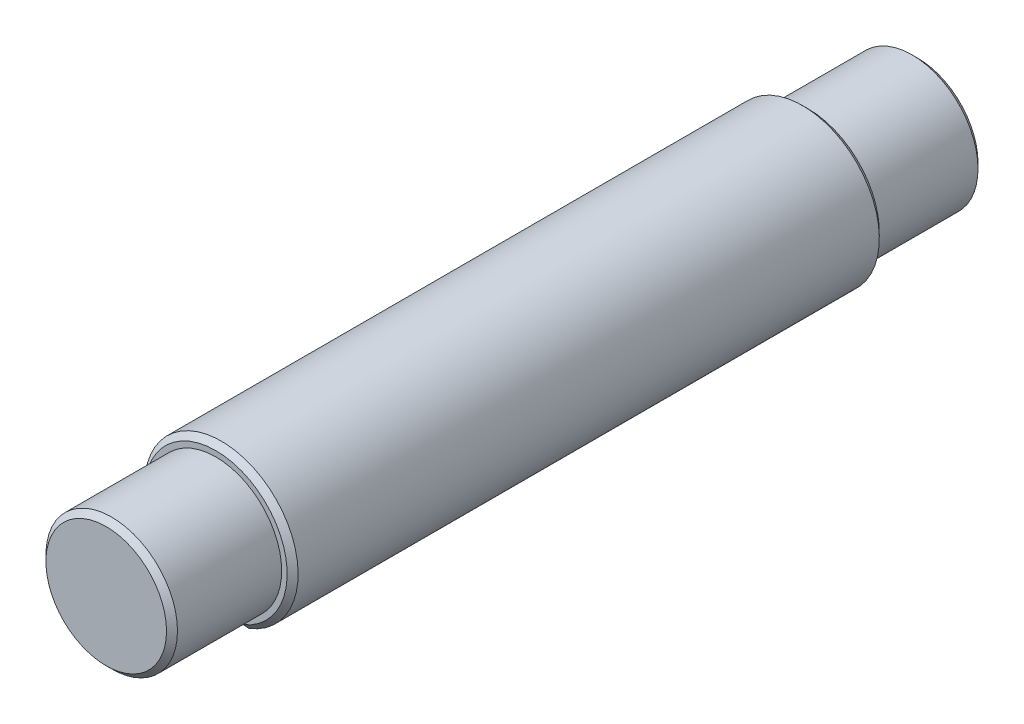
ISO-10303-21;
HEADER;
FILE_DESCRIPTION(('STEP AP214'),'2;1');
FILE_NAME('part.step','',(''),(''),'','','');
FILE_SCHEMA(('AUTOMOTIVE_DESIGN { 1 0 10303 214 1 1 1 1 }'));
ENDSEC;
DATA;
#1=APPLICATION_CONTEXT('core data for automotive mechanical design processes');
#2=APPLICATION_PROTOCOL_DEFINITION('international standard','automotive_design',2000,#1);
#3=PRODUCT_CONTEXT('',#1,'mechanical');
#4=PRODUCT('Part','Part','',(#3));
#5=PRODUCT_RELATED_PRODUCT_CATEGORY('part','',(#4));
#6=PRODUCT_DEFINITION_FORMATION('','',#4);
#7=PRODUCT_DEFINITION_CONTEXT('part definition',#1,'design');
#8=PRODUCT_DEFINITION('design','',#6,#7);
#9=PRODUCT_DEFINITION_SHAPE('','',#8);
#10=(LENGTH_UNIT() NAMED_UNIT(*) SI_UNIT(.MILLI.,.METRE.));
#11=(NAMED_UNIT(*) PLANE_ANGLE_UNIT() SI_UNIT($,.RADIAN.));
#12=(NAMED_UNIT(*) SI_UNIT($,.STERADIAN.) SOLID_ANGLE_UNIT());
#13=UNCERTAINTY_MEASURE_WITH_UNIT(LENGTH_MEASURE(1.E-05),#10,'distance_accuracy_value','');
#14=(GEOMETRIC_REPRESENTATION_CONTEXT(3) GLOBAL_UNCERTAINTY_ASSIGNED_CONTEXT((#13)) GLOBAL_UNIT_ASSIGNED_CONTEXT((#10,
#11,#12)) REPRESENTATION_CONTEXT('',''));
#15=CARTESIAN_POINT('',(0.,0.,0.));
#16=DIRECTION('',(0.,0.,1.));
#17=DIRECTION('',(1.,0.,0.));
#18=AXIS2_PLACEMENT_3D('',#15,#16,#17);
#19=CARTESIAN_POINT('',(0.,0.,37.));
#20=DIRECTION('',(0.,0.,-1.));
#21=DIRECTION('',(-1.,0.,0.));
#22=AXIS2_PLACEMENT_3D('',#19,#20,#21);
#23=CYLINDRICAL_SURFACE('',#22,7.);
#24=DIRECTION('',(0.,0.,-1.));
#25=VECTOR('',#24,1.);
#26=CARTESIAN_POINT('',(2.5,-6.53834841531101,37.));
#27=LINE('',#26,#25);
#28=CARTESIAN_POINT('',(2.5,-6.53834841531101,26.5));
#29=VERTEX_POINT('',#28);
#30=CARTESIAN_POINT('',(2.5,-6.53834841531101,-26.5));
#31=VERTEX_POINT('',#30);
#32=EDGE_CURVE('E146',#29,#31,#27,.T.);
#33=ORIENTED_EDGE('',*,*,#32,.T.);
#34=CARTESIAN_POINT('',(0.,0.,-26.5));
#35=DIRECTION('',(0.,0.,-1.));
#36=DIRECTION('',(-1.,0.,0.));
#37=AXIS2_PLACEMENT_3D('',#34,#35,#36);
#38=CIRCLE('',#37,7.);
#39=CARTESIAN_POINT('',(-2.5,-6.53834841531101,-26.5));
#40=VERTEX_POINT('',#39);
#41=EDGE_CURVE('E264',#31,#40,#38,.F.);
#42=ORIENTED_EDGE('',*,*,#41,.T.);
#43=DIRECTION('',(0.,0.,-1.));
#44=VECTOR('',#43,1.);
#45=CARTESIAN_POINT('',(-2.5,-6.53834841531101,37.));
#46=LINE('',#45,#44);
#47=CARTESIAN_POINT('',(-2.5,-6.53834841531101,26.5));
#48=VERTEX_POINT('',#47);
#49=EDGE_CURVE('E143',#40,#48,#46,.F.);
#50=ORIENTED_EDGE('',*,*,#49,.T.);
#51=CARTESIAN_POINT('',(0.,0.,26.5));
#52=DIRECTION('',(0.,0.,1.));
#53=DIRECTION('',(1.,0.,0.));
#54=AXIS2_PLACEMENT_3D('',#51,#52,#53);
#55=CIRCLE('',#54,7.);
#56=EDGE_CURVE('E263',#48,#29,#55,.F.);
#57=ORIENTED_EDGE('',*,*,#56,.T.);
#58=EDGE_LOOP('',(#33,#42,#50,#57));
#59=FACE_BOUND('',#58,.T.);
#60=ADVANCED_FACE('F36',(#59),#23,.T.);
#61=CARTESIAN_POINT('',(0.,-7.,27.));
#62=DIRECTION('',(0.,1.,0.));
#63=DIRECTION('',(0.,0.,1.));
#64=AXIS2_PLACEMENT_3D('',#61,#62,#63);
#65=CYLINDRICAL_SURFACE('',#64,2.5);
#66=CARTESIAN_POINT('',(-2.5,-5.45435605731786,27.));
#67=CARTESIAN_POINT('',(-2.50001024965806,-5.4543414367274,27.066990421397));
#68=CARTESIAN_POINT('',(-2.49730766074456,-5.45558986423115,27.1339728576071));
#69=CARTESIAN_POINT('',(-2.48655699342007,-5.46050344433192,27.267391217606));
#70=CARTESIAN_POINT('',(-2.47851112553775,-5.46416759753227,27.3338273558978));
#71=CARTESIAN_POINT('',(-2.45719882557102,-5.47378318611766,27.4654018598714));
#72=CARTESIAN_POINT('',(-2.44395446621823,-5.47972494833872,27.5305445048847));
#73=CARTESIAN_POINT('',(-2.41239773056354,-5.49369035165668,27.6593476505706));
#74=CARTESIAN_POINT('',(-2.39408500729503,-5.50171413528084,27.7230080494492));
#75=CARTESIAN_POINT('',(-2.33184505253746,-5.52852216859036,27.9109704766892));
#76=CARTESIAN_POINT('',(-2.28056973965756,-5.55006534458073,28.0325349409199));
#77=CARTESIAN_POINT('',(-2.16009667726577,-5.5980502687434,28.265394969978));
#78=CARTESIAN_POINT('',(-2.09088024017802,-5.62449711638194,28.3766796624162));
#79=CARTESIAN_POINT('',(-1.93194216605246,-5.6811173953285,28.5926555180297));
#80=CARTESIAN_POINT('',(-1.84129131772597,-5.71141645652258,28.6966314637586));
#81=CARTESIAN_POINT('',(-1.6440247325164,-5.77129106659512,28.8884169369691));
#82=CARTESIAN_POINT('',(-1.53740558511416,-5.80086645933832,28.9762230019235));
#83=CARTESIAN_POINT('',(-1.30552662419109,-5.85751079611205,29.1368988289762));
#84=CARTESIAN_POINT('',(-1.17965801419141,-5.88441492036276,29.2089534877025));
#85=CARTESIAN_POINT('',(-0.916263349803654,-5.93113050419022,29.3305523948046));
#86=CARTESIAN_POINT('',(-0.778742558960747,-5.95094514533806,29.3801067434128));
#87=CARTESIAN_POINT('',(-0.503538212911762,-5.98035028996095,29.4526785710471));
#88=CARTESIAN_POINT('',(-0.366235636683349,-5.99041924152298,29.4769429460133));
#89=CARTESIAN_POINT('',(-0.0891608856613057,-6.00093656296527,29.502275267891));
#90=CARTESIAN_POINT('',(0.0506103107853712,-6.00138866214753,29.5033522066188));
#91=CARTESIAN_POINT('',(0.319586702683726,-5.99290254661358,29.4829313516378));
#92=CARTESIAN_POINT('',(0.448917245472145,-5.98453414521297,29.4628034512649));
#93=CARTESIAN_POINT('',(0.702167963543972,-5.96013005449445,29.4028930910878));
#94=CARTESIAN_POINT('',(0.82608783415044,-5.94409393401056,29.3631095260154));
#95=CARTESIAN_POINT('',(1.06727556823007,-5.90559715444489,29.2645442163381));
#96=CARTESIAN_POINT('',(1.1844130633202,-5.88304219015531,29.2054818206956));
#97=CARTESIAN_POINT('',(1.40742238732224,-5.83371457161593,29.0703092180309));
#98=CARTESIAN_POINT('',(1.51329009151026,-5.80694038196897,28.9941928006955));
#99=CARTESIAN_POINT('',(1.71867537807254,-5.74963576527152,28.8208409664575));
#100=CARTESIAN_POINT('',(1.81722082953265,-5.71897359653013,28.7224958287417));
#101=CARTESIAN_POINT('',(1.99685313522822,-5.65876079183101,28.5105893535751));
#102=CARTESIAN_POINT('',(2.07793113494236,-5.62921072584973,28.3970203460054));
#103=CARTESIAN_POINT('',(2.22284514508405,-5.57361619012468,28.1531453498455));
#104=CARTESIAN_POINT('',(2.28601504206341,-5.54772171984214,28.0224071265261));
#105=CARTESIAN_POINT('',(2.38897619183128,-5.50417661447929,27.7508546265431));
#106=CARTESIAN_POINT('',(2.4288105117282,-5.48651080537515,27.6100594530022));
#107=CARTESIAN_POINT('',(2.47065526537902,-5.46773287951056,27.3898491565922));
#108=CARTESIAN_POINT('',(2.48164099212927,-5.46274303006064,27.3123689332134));
#109=CARTESIAN_POINT('',(2.49631631258703,-5.45604541462647,27.1566098186605));
#110=CARTESIAN_POINT('',(2.50000851178052,-5.45433647659977,27.0783312227393));
#111=CARTESIAN_POINT('',(2.5,-5.45435605731786,27.));
#112=B_SPLINE_CURVE_WITH_KNOTS('',3,(#66,#67,#68,#69,#70,#71,#72,#73,#74,#75,#76,#77,#78,#79,
#80,#81,#82,#83,#84,#85,#86,#87,#88,#89,#90,#91,#92,#93,#94,#95,#96,#97,#98,#99,#100,#101,#102,
#103,#104,#105,#106,#107,#108,#109,#110,#111),.UNSPECIFIED.,.F.,.F.,(4,2,2,2,2,2,2,2,2,2,2,2,2,
2,2,2,2,2,2,2,2,2,4),(0.,0.200891876435012,0.401700695097976,0.601665948391959,
0.801644894158599,1.20075599352942,1.6002844916061,2.02212344548655,2.44405262481498,
2.88432120276328,3.32439195134774,3.74155898035476,4.15856423395471,4.55019084443641,
4.94183947919071,5.33946474085078,5.73723503589979,6.16301556467703,6.58901142297275,
7.02923147484728,7.4686364954648,7.70350874445825,7.93829707423866),.UNSPECIFIED.);
#113=CARTESIAN_POINT('',(-2.5,-5.45435605731786,27.));
#114=VERTEX_POINT('',#113);
#115=CARTESIAN_POINT('',(2.5,-5.45435605731786,27.));
#116=VERTEX_POINT('',#115);
#117=EDGE_CURVE('E124',#114,#116,#112,.T.);
#118=ORIENTED_EDGE('',*,*,#117,.F.);
#119=DIRECTION('',(0.,1.,0.));
#120=VECTOR('',#119,1.);
#121=CARTESIAN_POINT('',(-2.5,-7.,27.));
#122=LINE('',#121,#120);
#123=CARTESIAN_POINT('',(-2.5,-4.,27.));
#124=VERTEX_POINT('',#123);
#125=EDGE_CURVE('E113',#114,#124,#122,.T.);
#126=ORIENTED_EDGE('',*,*,#125,.T.);
#127=CARTESIAN_POINT('',(0.,-4.,27.));
#128=DIRECTION('',(0.,1.,0.));
#129=DIRECTION('',(0.,0.,1.));
#130=AXIS2_PLACEMENT_3D('',#127,#128,#129);
#131=CIRCLE('',#130,2.5);
#132=CARTESIAN_POINT('',(2.5,-4.,27.));
#133=VERTEX_POINT('',#132);
#134=EDGE_CURVE('E282',#124,#133,#131,.T.);
#135=ORIENTED_EDGE('',*,*,#134,.T.);
#136=DIRECTION('',(0.,1.,0.));
#137=VECTOR('',#136,1.);
#138=CARTESIAN_POINT('',(2.5,-7.,27.));
#139=LINE('',#138,#137);
#140=EDGE_CURVE('E142',#116,#133,#139,.T.);
#141=ORIENTED_EDGE('',*,*,#140,.F.);
#142=EDGE_LOOP('',(#118,#126,#135,#141));
#143=FACE_BOUND('',#142,.T.);
#144=ADVANCED_FACE('F163',(#143),#65,.F.);
#145=CARTESIAN_POINT('',(-2.5,-7.,27.));
#146=DIRECTION('',(-1.,0.,0.));
#147=DIRECTION('',(0.,0.,1.));
#148=AXIS2_PLACEMENT_3D('',#145,#146,#147);
#149=PLANE('',#148);
#150=ORIENTED_EDGE('',*,*,#49,.F.);
#151=CARTESIAN_POINT('',(-2.5,-6.53834841531101,-26.5));
#152=CARTESIAN_POINT('',(-2.5,-6.44886881436809,-26.5835972549309));
#153=CARTESIAN_POINT('',(-2.50000000000001,-6.35926664955848,-26.6670625457351));
#154=CARTESIAN_POINT('',(-2.50000000000001,-6.17981717782742,-26.833729212444));
#155=CARTESIAN_POINT('',(-2.50000000000001,-6.0899698708667,-26.9169305883065));
#156=CARTESIAN_POINT('',(-2.50000000000001,-6.,-27.));
#157=B_SPLINE_CURVE_WITH_KNOTS('',3,(#151,#152,#153,#154,#155,#156),.UNSPECIFIED.,.F.,.F.,(4,2,
4),(0.,0.367362252236527,0.734724563343162),.UNSPECIFIED.);
#158=CARTESIAN_POINT('',(-2.50000000000001,-6.,-27.));
#159=VERTEX_POINT('',#158);
#160=EDGE_CURVE('E111',#40,#159,#157,.T.);
#161=ORIENTED_EDGE('',*,*,#160,.T.);
#162=DIRECTION('',(0.,1.,0.));
#163=VECTOR('',#162,1.);
#164=CARTESIAN_POINT('',(-2.50000000000001,-7.,-27.));
#165=LINE('',#164,#163);
#166=CARTESIAN_POINT('',(-2.50000000000001,-5.45435605731785,-27.));
#167=VERTEX_POINT('',#166);
#168=EDGE_CURVE('E103',#159,#167,#165,.T.);
#169=ORIENTED_EDGE('',*,*,#168,.T.);
#170=CARTESIAN_POINT('',(-2.50000000000001,-4.,-27.));
#171=VERTEX_POINT('',#170);
#172=EDGE_CURVE('E109',#167,#171,#165,.T.);
#173=ORIENTED_EDGE('',*,*,#172,.T.);
#174=DIRECTION('',(0.,0.,1.));
#175=VECTOR('',#174,1.);
#176=CARTESIAN_POINT('',(-2.5,-4.,27.));
#177=LINE('',#176,#175);
#178=EDGE_CURVE('E280',#171,#124,#177,.T.);
#179=ORIENTED_EDGE('',*,*,#178,.T.);
#180=ORIENTED_EDGE('',*,*,#125,.F.);
#181=CARTESIAN_POINT('',(-2.5,-6.00000000000001,27.));
#182=VERTEX_POINT('',#181);
#183=EDGE_CURVE('E137',#182,#114,#122,.T.);
#184=ORIENTED_EDGE('',*,*,#183,.F.);
#185=CARTESIAN_POINT('',(-2.5,-6.00000000000001,27.));
#186=CARTESIAN_POINT('',(-2.5,-6.08996987086671,26.9169305883065));
#187=CARTESIAN_POINT('',(-2.5,-6.17981717782743,26.833729212444));
#188=CARTESIAN_POINT('',(-2.5,-6.35926664955848,26.6670625457351));
#189=CARTESIAN_POINT('',(-2.5,-6.44886881436809,26.5835972549309));
#190=CARTESIAN_POINT('',(-2.5,-6.53834841531101,26.5));
#191=B_SPLINE_CURVE_WITH_KNOTS('',3,(#185,#186,#187,#188,#189,#190),.UNSPECIFIED.,.F.,.F.,(4,2,
4),(0.,0.367362311106631,0.734724563343148),.UNSPECIFIED.);
#192=EDGE_CURVE('E188',#182,#48,#191,.T.);
#193=ORIENTED_EDGE('',*,*,#192,.T.);
#194=EDGE_LOOP('',(#150,#161,#169,#173,#179,#180,#184,#193));
#195=FACE_BOUND('',#194,.T.);
#196=ADVANCED_FACE('F106',(#195),#149,.F.);
#197=CARTESIAN_POINT('',(0.,-7.,-27.));
#198=DIRECTION('',(0.,1.,0.));
#199=DIRECTION('',(0.,0.,1.));
#200=AXIS2_PLACEMENT_3D('',#197,#198,#199);
#201=CYLINDRICAL_SURFACE('',#200,2.5);
#202=ORIENTED_EDGE('',*,*,#172,.F.);
#203=CARTESIAN_POINT('',(-2.50000000000001,-5.45435605731785,-27.));
#204=CARTESIAN_POINT('',(-2.50001024965807,-5.4543414367274,-27.066990421397));
#205=CARTESIAN_POINT('',(-2.49730766074457,-5.45558986423114,-27.1339728576071));
#206=CARTESIAN_POINT('',(-2.48655699342008,-5.46050344433191,-27.267391217606));
#207=CARTESIAN_POINT('',(-2.47851112553776,-5.46416759753227,-27.3338273558978));
#208=CARTESIAN_POINT('',(-2.45719882557103,-5.47378318611766,-27.4654018598714));
#209=CARTESIAN_POINT('',(-2.44395446621824,-5.47972494833871,-27.5305445048847));
#210=CARTESIAN_POINT('',(-2.41239773056355,-5.49369035165668,-27.6593476505706));
#211=CARTESIAN_POINT('',(-2.39408500729504,-5.50171413528084,-27.7230080494492));
#212=CARTESIAN_POINT('',(-2.33184505253747,-5.52852216859035,-27.9109704766892));
#213=CARTESIAN_POINT('',(-2.28056973965757,-5.55006534458072,-28.0325349409199));
#214=CARTESIAN_POINT('',(-2.16009667726578,-5.5980502687434,-28.265394969978));
#215=CARTESIAN_POINT('',(-2.09088024017803,-5.62449711638193,-28.3766796624162));
#216=CARTESIAN_POINT('',(-1.93194216605247,-5.68111739532849,-28.5926555180297));
#217=CARTESIAN_POINT('',(-1.84129131772598,-5.71141645652258,-28.6966314637586));
#218=CARTESIAN_POINT('',(-1.64402473251641,-5.77129106659511,-28.8884169369691));
#219=CARTESIAN_POINT('',(-1.53740558511417,-5.80086645933831,-28.9762230019235));
#220=CARTESIAN_POINT('',(-1.3055266241911,-5.85751079611204,-29.1368988289762));
#221=CARTESIAN_POINT('',(-1.17965801419142,-5.88441492036275,-29.2089534877025));
#222=CARTESIAN_POINT('',(-0.916263349803665,-5.93113050419022,-29.3305523948046));
#223=CARTESIAN_POINT('',(-0.778742558960759,-5.95094514533806,-29.3801067434128));
#224=CARTESIAN_POINT('',(-0.503538212911774,-5.98035028996094,-29.4526785710471));
#225=CARTESIAN_POINT('',(-0.366235636683361,-5.99041924152298,-29.4769429460133));
#226=CARTESIAN_POINT('',(-0.0891608856613166,-6.00093656296527,-29.502275267891));
#227=CARTESIAN_POINT('',(0.0506103107853606,-6.00138866214753,-29.5033522066188));
#228=CARTESIAN_POINT('',(0.319586702683715,-5.99290254661358,-29.4829313516378));
#229=CARTESIAN_POINT('',(0.448917245472135,-5.98453414521297,-29.4628034512649));
#230=CARTESIAN_POINT('',(0.702167963543962,-5.96013005449446,-29.4028930910878));
#231=CARTESIAN_POINT('',(0.82608783415043,-5.94409393401056,-29.3631095260154));
#232=CARTESIAN_POINT('',(1.06727556823006,-5.90559715444489,-29.2645442163381));
#233=CARTESIAN_POINT('',(1.1844130633202,-5.88304219015532,-29.2054818206956));
#234=CARTESIAN_POINT('',(1.40742238732223,-5.83371457161593,-29.0703092180309));
#235=CARTESIAN_POINT('',(1.51329009151025,-5.80694038196897,-28.9941928006955));
#236=CARTESIAN_POINT('',(1.71867537807253,-5.74963576527152,-28.8208409664575));
#237=CARTESIAN_POINT('',(1.81722082953264,-5.71897359653014,-28.7224958287417));
#238=CARTESIAN_POINT('',(1.99685313522821,-5.65876079183101,-28.5105893535751));
#239=CARTESIAN_POINT('',(2.07793113494235,-5.62921072584973,-28.3970203460054));
#240=CARTESIAN_POINT('',(2.22284514508404,-5.57361619012468,-28.1531453498455));
#241=CARTESIAN_POINT('',(2.2860150420634,-5.54772171984215,-28.0224071265261));
#242=CARTESIAN_POINT('',(2.38897619183127,-5.5041766144793,-27.7508546265431));
#243=CARTESIAN_POINT('',(2.42881051172819,-5.48651080537515,-27.6100594530022));
#244=CARTESIAN_POINT('',(2.47065526537901,-5.46773287951056,-27.3898491565922));
#245=CARTESIAN_POINT('',(2.48164099212925,-5.46274303006064,-27.3123689332134));
#246=CARTESIAN_POINT('',(2.49631631258702,-5.45604541462647,-27.1566098186605));
#247=CARTESIAN_POINT('',(2.50000851178051,-5.45433647659978,-27.0783312227393));
#248=CARTESIAN_POINT('',(2.49999999999999,-5.45435605731786,-27.));
#249=B_SPLINE_CURVE_WITH_KNOTS('',3,(#203,#204,#205,#206,#207,#208,#209,#210,#211,#212,#213,
#214,#215,#216,#217,#218,#219,#220,#221,#222,#223,#224,#225,#226,#227,#228,#229,#230,#231,#232,
#233,#234,#235,#236,#237,#238,#239,#240,#241,#242,#243,#244,#245,#246,#247,#248),.UNSPECIFIED.,
.F.,.F.,(4,2,2,2,2,2,2,2,2,2,2,2,2,2,2,2,2,2,2,2,2,2,4),(0.,0.200891876435012,0.401700695097976,
0.601665948391959,0.801644894158599,1.20075599352942,1.6002844916061,2.02212344548655,
2.44405262481498,2.88432120276328,3.32439195134774,3.74155898035476,4.15856423395471,
4.55019084443641,4.94183947919071,5.33946474085078,5.73723503589979,6.16301556467703,
6.58901142297275,7.02923147484728,7.4686364954648,7.70350874445825,7.93829707423866),.UNSPECIFIED.);
#250=CARTESIAN_POINT('',(2.49999999999999,-5.45435605731786,-27.));
#251=VERTEX_POINT('',#250);
#252=EDGE_CURVE('E118',#167,#251,#249,.T.);
#253=ORIENTED_EDGE('',*,*,#252,.T.);
#254=DIRECTION('',(0.,1.,0.));
#255=VECTOR('',#254,1.);
#256=CARTESIAN_POINT('',(2.49999999999999,-7.,-27.));
#257=LINE('',#256,#255);
#258=CARTESIAN_POINT('',(2.49999999999999,-4.,-27.));
#259=VERTEX_POINT('',#258);
#260=EDGE_CURVE('E134',#251,#259,#257,.T.);
#261=ORIENTED_EDGE('',*,*,#260,.T.);
#262=CARTESIAN_POINT('',(0.,-4.,-27.));
#263=DIRECTION('',(0.,1.,0.));
#264=DIRECTION('',(0.,0.,1.));
#265=AXIS2_PLACEMENT_3D('',#262,#263,#264);
#266=CIRCLE('',#265,2.5);
#267=EDGE_CURVE('E132',#259,#171,#266,.T.);
#268=ORIENTED_EDGE('',*,*,#267,.T.);
#269=EDGE_LOOP('',(#202,#253,#261,#268));
#270=FACE_BOUND('',#269,.T.);
#271=ADVANCED_FACE('F130',(#270),#201,.F.);
#272=CARTESIAN_POINT('',(2.5,-7.,27.));
#273=DIRECTION('',(1.,0.,0.));
#274=DIRECTION('',(0.,0.,-1.));
#275=AXIS2_PLACEMENT_3D('',#272,#273,#274);
#276=PLANE('',#275);
#277=CARTESIAN_POINT('',(2.49999999999999,-6.00000000000001,-27.));
#278=VERTEX_POINT('',#277);
#279=EDGE_CURVE('E127',#278,#251,#257,.T.);
#280=ORIENTED_EDGE('',*,*,#279,.F.);
#281=CARTESIAN_POINT('',(2.49999999999999,-6.00000000000001,-27.));
#282=CARTESIAN_POINT('',(2.49999999999999,-6.0899698708667,-26.9169305883065));
#283=CARTESIAN_POINT('',(2.49999999999999,-6.17981717782743,-26.833729212444));
#284=CARTESIAN_POINT('',(2.49999999999999,-6.35926664955848,-26.6670625457351));
#285=CARTESIAN_POINT('',(2.49999999999999,-6.44886881436809,-26.5835972549309));
#286=CARTESIAN_POINT('',(2.49999999999999,-6.53834841531101,-26.5));
#287=B_SPLINE_CURVE_WITH_KNOTS('',3,(#281,#282,#283,#284,#285,#286),.UNSPECIFIED.,.F.,.F.,(4,2,
4),(0.,0.36736231110663,0.734724563343154),.UNSPECIFIED.);
#288=EDGE_CURVE('E46',#278,#31,#287,.T.);
#289=ORIENTED_EDGE('',*,*,#288,.T.);
#290=ORIENTED_EDGE('',*,*,#32,.F.);
#291=CARTESIAN_POINT('',(2.5,-6.53834841531101,26.5));
#292=CARTESIAN_POINT('',(2.5,-6.44886881436809,26.5835972549309));
#293=CARTESIAN_POINT('',(2.5,-6.35926664955848,26.6670625457351));
#294=CARTESIAN_POINT('',(2.5,-6.17981717782743,26.833729212444));
#295=CARTESIAN_POINT('',(2.5,-6.08996987086671,26.9169305883065));
#296=CARTESIAN_POINT('',(2.5,-6.00000000000001,27.));
#297=B_SPLINE_CURVE_WITH_KNOTS('',3,(#291,#292,#293,#294,#295,#296),.UNSPECIFIED.,.F.,.F.,(4,2,
4),(0.,0.367362252236518,0.734724563343146),.UNSPECIFIED.);
#298=CARTESIAN_POINT('',(2.5,-6.00000000000001,27.));
#299=VERTEX_POINT('',#298);
#300=EDGE_CURVE('E53',#29,#299,#297,.T.);
#301=ORIENTED_EDGE('',*,*,#300,.T.);
#302=EDGE_CURVE('E140',#299,#116,#139,.T.);
#303=ORIENTED_EDGE('',*,*,#302,.T.);
#304=ORIENTED_EDGE('',*,*,#140,.T.);
#305=DIRECTION('',(0.,0.,-1.));
#306=VECTOR('',#305,1.);
#307=CARTESIAN_POINT('',(2.5,-4.,27.));
#308=LINE('',#307,#306);
#309=EDGE_CURVE('E277',#133,#259,#308,.T.);
#310=ORIENTED_EDGE('',*,*,#309,.T.);
#311=ORIENTED_EDGE('',*,*,#260,.F.);
#312=EDGE_LOOP('',(#280,#289,#290,#301,#303,#304,#310,#311));
#313=FACE_BOUND('',#312,.T.);
#314=ADVANCED_FACE('F181',(#313),#276,.F.);
#315=CARTESIAN_POINT('',(0.,-4.,27.));
#316=DIRECTION('',(0.,1.,0.));
#317=DIRECTION('',(0.,0.,1.));
#318=AXIS2_PLACEMENT_3D('',#315,#316,#317);
#319=PLANE('',#318);
#320=ORIENTED_EDGE('',*,*,#134,.F.);
#321=ORIENTED_EDGE('',*,*,#178,.F.);
#322=ORIENTED_EDGE('',*,*,#267,.F.);
#323=ORIENTED_EDGE('',*,*,#309,.F.);
#324=EDGE_LOOP('',(#320,#321,#322,#323));
#325=FACE_BOUND('',#324,.T.);
#326=ADVANCED_FACE('F173',(#325),#319,.F.);
#327=CARTESIAN_POINT('',(0.,0.,27.));
#328=DIRECTION('',(0.,0.,1.));
#329=DIRECTION('',(1.,0.,0.));
#330=AXIS2_PLACEMENT_3D('',#327,#328,#329);
#331=CYLINDRICAL_SURFACE('',#330,6.);
#332=CARTESIAN_POINT('',(0.,0.,36.5));
#333=DIRECTION('',(0.,0.,1.));
#334=DIRECTION('',(1.,0.,0.));
#335=AXIS2_PLACEMENT_3D('',#332,#333,#334);
#336=CIRCLE('',#335,6.);
#337=CARTESIAN_POINT('',(6.,0.,36.5));
#338=VERTEX_POINT('',#337);
#339=EDGE_CURVE('E260',#338,#338,#336,.F.);
#340=ORIENTED_EDGE('',*,*,#339,.T.);
#341=EDGE_LOOP('',(#340));
#342=FACE_BOUND('',#341,.T.);
#343=ORIENTED_EDGE('',*,*,#117,.T.);
#344=CARTESIAN_POINT('',(0.,0.,27.));
#345=DIRECTION('',(0.,0.,1.));
#346=DIRECTION('',(1.,0.,0.));
#347=AXIS2_PLACEMENT_3D('',#344,#345,#346);
#348=CIRCLE('',#347,6.);
#349=EDGE_CURVE('E128',#116,#114,#348,.T.);
#350=ORIENTED_EDGE('',*,*,#349,.T.);
#351=EDGE_LOOP('',(#343,#350));
#352=FACE_BOUND('',#351,.T.);
#353=ADVANCED_FACE('F167',(#342,#352),#331,.T.);
#354=CARTESIAN_POINT('',(0.,0.,27.));
#355=DIRECTION('',(0.,0.,1.));
#356=DIRECTION('',(1.,0.,0.));
#357=AXIS2_PLACEMENT_3D('',#354,#355,#356);
#358=PLANE('',#357);
#359=ORIENTED_EDGE('',*,*,#302,.F.);
#360=CARTESIAN_POINT('',(0.,0.,27.));
#361=DIRECTION('',(0.,0.,1.));
#362=DIRECTION('',(1.,0.,0.));
#363=AXIS2_PLACEMENT_3D('',#360,#361,#362);
#364=CIRCLE('',#363,6.50000000000001);
#365=EDGE_CURVE('E11',#299,#182,#364,.T.);
#366=ORIENTED_EDGE('',*,*,#365,.T.);
#367=ORIENTED_EDGE('',*,*,#183,.T.);
#368=ORIENTED_EDGE('',*,*,#349,.F.);
#369=EDGE_LOOP('',(#359,#366,#367,#368));
#370=FACE_BOUND('',#369,.T.);
#371=ADVANCED_FACE('F172',(#370),#358,.T.);
#372=CARTESIAN_POINT('',(0.,0.,37.));
#373=DIRECTION('',(0.,0.,1.));
#374=DIRECTION('',(1.,0.,0.));
#375=AXIS2_PLACEMENT_3D('',#372,#373,#374);
#376=PLANE('',#375);
#377=CARTESIAN_POINT('',(0.,0.,37.));
#378=DIRECTION('',(0.,0.,1.));
#379=DIRECTION('',(1.,0.,0.));
#380=AXIS2_PLACEMENT_3D('',#377,#378,#379);
#381=CIRCLE('',#380,5.49999999999999);
#382=CARTESIAN_POINT('',(5.49999999999999,0.,37.));
#383=VERTEX_POINT('',#382);
#384=EDGE_CURVE('E255',#383,#383,#381,.T.);
#385=ORIENTED_EDGE('',*,*,#384,.T.);
#386=EDGE_LOOP('',(#385));
#387=FACE_BOUND('',#386,.T.);
#388=ADVANCED_FACE('F177',(#387),#376,.T.);
#389=CARTESIAN_POINT('',(0.,0.,-27.));
#390=DIRECTION('',(0.,0.,-1.));
#391=DIRECTION('',(-1.,0.,0.));
#392=AXIS2_PLACEMENT_3D('',#389,#390,#391);
#393=CYLINDRICAL_SURFACE('',#392,6.);
#394=CARTESIAN_POINT('',(0.,0.,-36.5));
#395=DIRECTION('',(0.,0.,1.));
#396=DIRECTION('',(1.,0.,0.));
#397=AXIS2_PLACEMENT_3D('',#394,#395,#396);
#398=CIRCLE('',#397,6.);
#399=CARTESIAN_POINT('',(6.,0.,-36.5));
#400=VERTEX_POINT('',#399);
#401=EDGE_CURVE('E123',#400,#400,#398,.T.);
#402=ORIENTED_EDGE('',*,*,#401,.T.);
#403=EDGE_LOOP('',(#402));
#404=FACE_BOUND('',#403,.T.);
#405=CARTESIAN_POINT('',(0.,0.,-27.));
#406=DIRECTION('',(0.,0.,1.));
#407=DIRECTION('',(1.,0.,0.));
#408=AXIS2_PLACEMENT_3D('',#405,#406,#407);
#409=CIRCLE('',#408,6.);
#410=EDGE_CURVE('E120',#251,#167,#409,.T.);
#411=ORIENTED_EDGE('',*,*,#410,.F.);
#412=ORIENTED_EDGE('',*,*,#252,.F.);
#413=EDGE_LOOP('',(#411,#412));
#414=FACE_BOUND('',#413,.T.);
#415=ADVANCED_FACE('F119',(#404,#414),#393,.T.);
#416=CARTESIAN_POINT('',(0.,0.,-27.));
#417=DIRECTION('',(0.,0.,-1.));
#418=DIRECTION('',(1.,0.,0.));
#419=AXIS2_PLACEMENT_3D('',#416,#417,#418);
#420=PLANE('',#419);
#421=ORIENTED_EDGE('',*,*,#168,.F.);
#422=CARTESIAN_POINT('',(0.,0.,-27.));
#423=DIRECTION('',(0.,0.,-1.));
#424=DIRECTION('',(-1.,0.,0.));
#425=AXIS2_PLACEMENT_3D('',#422,#423,#424);
#426=CIRCLE('',#425,6.50000000000001);
#427=EDGE_CURVE('E61',#159,#278,#426,.T.);
#428=ORIENTED_EDGE('',*,*,#427,.T.);
#429=ORIENTED_EDGE('',*,*,#279,.T.);
#430=ORIENTED_EDGE('',*,*,#410,.T.);
#431=EDGE_LOOP('',(#421,#428,#429,#430));
#432=FACE_BOUND('',#431,.T.);
#433=ADVANCED_FACE('F126',(#432),#420,.T.);
#434=CARTESIAN_POINT('',(0.,0.,-37.));
#435=DIRECTION('',(0.,0.,1.));
#436=DIRECTION('',(1.,0.,0.));
#437=AXIS2_PLACEMENT_3D('',#434,#435,#436);
#438=PLANE('',#437);
#439=CARTESIAN_POINT('',(0.,0.,-37.));
#440=DIRECTION('',(0.,0.,1.));
#441=DIRECTION('',(1.,0.,0.));
#442=AXIS2_PLACEMENT_3D('',#439,#440,#441);
#443=CIRCLE('',#442,5.5);
#444=CARTESIAN_POINT('',(5.5,0.,-37.));
#445=VERTEX_POINT('',#444);
#446=EDGE_CURVE('E251',#445,#445,#443,.F.);
#447=ORIENTED_EDGE('',*,*,#446,.T.);
#448=EDGE_LOOP('',(#447));
#449=FACE_BOUND('',#448,.T.);
#450=ADVANCED_FACE('F235',(#449),#438,.F.);
#451=CARTESIAN_POINT('',(0.,0.,-36.5));
#452=DIRECTION('',(0.,0.,1.));
#453=DIRECTION('',(1.,0.,0.));
#454=AXIS2_PLACEMENT_3D('',#451,#452,#453);
#455=CONICAL_SURFACE('',#454,6.,0.785398163397451);
#456=ORIENTED_EDGE('',*,*,#446,.F.);
#457=EDGE_LOOP('',(#456));
#458=FACE_BOUND('',#457,.T.);
#459=ORIENTED_EDGE('',*,*,#401,.F.);
#460=EDGE_LOOP('',(#459));
#461=FACE_BOUND('',#460,.T.);
#462=ADVANCED_FACE('F237',(#458,#461),#455,.T.);
#463=CARTESIAN_POINT('',(0.,0.,37.));
#464=DIRECTION('',(0.,0.,-1.));
#465=DIRECTION('',(-1.,0.,0.));
#466=AXIS2_PLACEMENT_3D('',#463,#464,#465);
#467=CONICAL_SURFACE('',#466,5.49999999999999,0.785398163397451);
#468=ORIENTED_EDGE('',*,*,#339,.F.);
#469=EDGE_LOOP('',(#468));
#470=FACE_BOUND('',#469,.T.);
#471=ORIENTED_EDGE('',*,*,#384,.F.);
#472=EDGE_LOOP('',(#471));
#473=FACE_BOUND('',#472,.T.);
#474=ADVANCED_FACE('F209',(#470,#473),#467,.T.);
#475=CARTESIAN_POINT('',(0.,0.,-26.5));
#476=DIRECTION('',(0.,0.,1.));
#477=DIRECTION('',(1.,0.,0.));
#478=AXIS2_PLACEMENT_3D('',#475,#476,#477);
#479=CONICAL_SURFACE('',#478,7.,0.785398163397448);
#480=ORIENTED_EDGE('',*,*,#288,.F.);
#481=ORIENTED_EDGE('',*,*,#427,.F.);
#482=ORIENTED_EDGE('',*,*,#160,.F.);
#483=ORIENTED_EDGE('',*,*,#41,.F.);
#484=EDGE_LOOP('',(#480,#481,#482,#483));
#485=FACE_BOUND('',#484,.T.);
#486=ADVANCED_FACE('F202',(#485),#479,.T.);
#487=CARTESIAN_POINT('',(0.,0.,27.));
#488=DIRECTION('',(0.,0.,-1.));
#489=DIRECTION('',(-1.,0.,0.));
#490=AXIS2_PLACEMENT_3D('',#487,#488,#489);
#491=CONICAL_SURFACE('',#490,6.50000000000001,0.785398163397453);
#492=ORIENTED_EDGE('',*,*,#300,.F.);
#493=ORIENTED_EDGE('',*,*,#56,.F.);
#494=ORIENTED_EDGE('',*,*,#192,.F.);
#495=ORIENTED_EDGE('',*,*,#365,.F.);
#496=EDGE_LOOP('',(#492,#493,#494,#495));
#497=FACE_BOUND('',#496,.T.);
#498=ADVANCED_FACE('F39',(#497),#491,.T.);
#499=CLOSED_SHELL('',(#60,#144,#196,#271,#314,#326,#353,#371,#388,#415,#433,#450,#462,#474,#486,#498));
#500=MANIFOLD_SOLID_BREP('B2',#499);
#501=ADVANCED_BREP_SHAPE_REPRESENTATION('',(#18,#500),#14);
#502=SHAPE_DEFINITION_REPRESENTATION(#9,#501);
ENDSEC;
END-ISO-10303-21;
